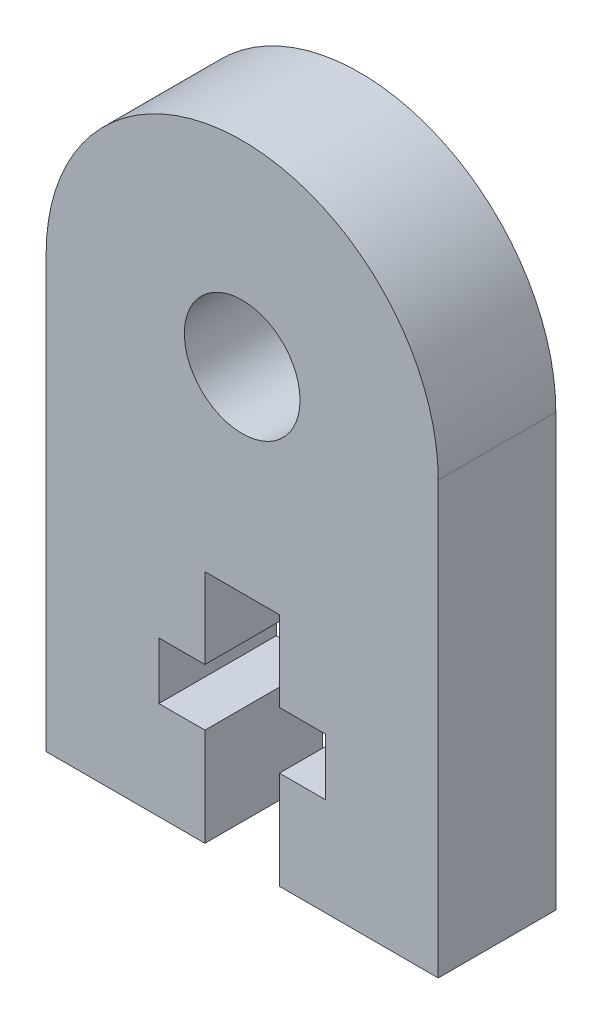
ISO-10303-21;
HEADER;
FILE_DESCRIPTION(('STEP AP214'),'2;1');
FILE_NAME('part.step','',(''),(''),'','','');
FILE_SCHEMA(('AUTOMOTIVE_DESIGN { 1 0 10303 214 1 1 1 1 }'));
ENDSEC;
DATA;
#1=APPLICATION_CONTEXT('core data for automotive mechanical design processes');
#2=APPLICATION_PROTOCOL_DEFINITION('international standard','automotive_design',2000,#1);
#3=PRODUCT_CONTEXT('',#1,'mechanical');
#4=PRODUCT('Part','Part','',(#3));
#5=PRODUCT_RELATED_PRODUCT_CATEGORY('part','',(#4));
#6=PRODUCT_DEFINITION_FORMATION('','',#4);
#7=PRODUCT_DEFINITION_CONTEXT('part definition',#1,'design');
#8=PRODUCT_DEFINITION('design','',#6,#7);
#9=PRODUCT_DEFINITION_SHAPE('','',#8);
#10=(LENGTH_UNIT() NAMED_UNIT(*) SI_UNIT(.MILLI.,.METRE.));
#11=(NAMED_UNIT(*) PLANE_ANGLE_UNIT() SI_UNIT($,.RADIAN.));
#12=(NAMED_UNIT(*) SI_UNIT($,.STERADIAN.) SOLID_ANGLE_UNIT());
#13=UNCERTAINTY_MEASURE_WITH_UNIT(LENGTH_MEASURE(1.E-05),#10,'distance_accuracy_value','');
#14=(GEOMETRIC_REPRESENTATION_CONTEXT(3) GLOBAL_UNCERTAINTY_ASSIGNED_CONTEXT((#13)) GLOBAL_UNIT_ASSIGNED_CONTEXT((#10,
#11,#12)) REPRESENTATION_CONTEXT('',''));
#15=CARTESIAN_POINT('',(0.,0.,0.));
#16=DIRECTION('',(0.,0.,1.));
#17=DIRECTION('',(1.,0.,0.));
#18=AXIS2_PLACEMENT_3D('',#15,#16,#17);
#19=CARTESIAN_POINT('',(-10.,-22.,6.));
#20=DIRECTION('',(0.,1.,0.));
#21=DIRECTION('',(-1.,0.,0.));
#22=AXIS2_PLACEMENT_3D('',#19,#20,#21);
#23=PLANE('',#22);
#24=DIRECTION('',(1.,0.,0.));
#25=VECTOR('',#24,1.);
#26=CARTESIAN_POINT('',(-10.,-22.,0.));
#27=LINE('',#26,#25);
#28=CARTESIAN_POINT('',(-10.,-22.,0.));
#29=VERTEX_POINT('',#28);
#30=CARTESIAN_POINT('',(-1.90000000000001,-22.,0.));
#31=VERTEX_POINT('',#30);
#32=EDGE_CURVE('E173',#29,#31,#27,.T.);
#33=ORIENTED_EDGE('',*,*,#32,.T.);
#34=DIRECTION('',(0.,0.,1.));
#35=VECTOR('',#34,1.);
#36=CARTESIAN_POINT('',(-1.90000000000001,-22.,0.));
#37=LINE('',#36,#35);
#38=CARTESIAN_POINT('',(-1.90000000000001,-22.,6.));
#39=VERTEX_POINT('',#38);
#40=EDGE_CURVE('E156',#31,#39,#37,.T.);
#41=ORIENTED_EDGE('',*,*,#40,.T.);
#42=DIRECTION('',(1.,0.,0.));
#43=VECTOR('',#42,1.);
#44=CARTESIAN_POINT('',(-10.,-22.,6.));
#45=LINE('',#44,#43);
#46=CARTESIAN_POINT('',(-10.,-22.,6.));
#47=VERTEX_POINT('',#46);
#48=EDGE_CURVE('E220',#47,#39,#45,.T.);
#49=ORIENTED_EDGE('',*,*,#48,.F.);
#50=DIRECTION('',(0.,0.,-1.));
#51=VECTOR('',#50,1.);
#52=CARTESIAN_POINT('',(-10.,-22.,6.));
#53=LINE('',#52,#51);
#54=EDGE_CURVE('E178',#47,#29,#53,.T.);
#55=ORIENTED_EDGE('',*,*,#54,.T.);
#56=EDGE_LOOP('',(#33,#41,#49,#55));
#57=FACE_BOUND('',#56,.T.);
#58=ADVANCED_FACE('F33',(#57),#23,.F.);
#59=CARTESIAN_POINT('',(0.,0.,6.));
#60=DIRECTION('',(0.,0.,-1.));
#61=DIRECTION('',(-1.,0.,0.));
#62=AXIS2_PLACEMENT_3D('',#59,#60,#61);
#63=PLANE('',#62);
#64=ORIENTED_EDGE('',*,*,#48,.T.);
#65=DIRECTION('',(0.,-1.,0.));
#66=VECTOR('',#65,1.);
#67=CARTESIAN_POINT('',(-1.90000000000001,-22.,6.));
#68=LINE('',#67,#66);
#69=CARTESIAN_POINT('',(-1.90000000000001,-17.,6.));
#70=VERTEX_POINT('',#69);
#71=EDGE_CURVE('E162',#70,#39,#68,.T.);
#72=ORIENTED_EDGE('',*,*,#71,.F.);
#73=DIRECTION('',(1.,0.,0.));
#74=VECTOR('',#73,1.);
#75=CARTESIAN_POINT('',(-4.25,-17.,6.));
#76=LINE('',#75,#74);
#77=CARTESIAN_POINT('',(-4.25,-17.,6.));
#78=VERTEX_POINT('',#77);
#79=EDGE_CURVE('E176',#78,#70,#76,.T.);
#80=ORIENTED_EDGE('',*,*,#79,.F.);
#81=DIRECTION('',(0.,-1.,0.));
#82=VECTOR('',#81,1.);
#83=CARTESIAN_POINT('',(-4.25,-14.1,6.));
#84=LINE('',#83,#82);
#85=CARTESIAN_POINT('',(-4.25,-14.1,6.));
#86=VERTEX_POINT('',#85);
#87=EDGE_CURVE('E255',#86,#78,#84,.T.);
#88=ORIENTED_EDGE('',*,*,#87,.F.);
#89=DIRECTION('',(-1.,0.,0.));
#90=VECTOR('',#89,1.);
#91=CARTESIAN_POINT('',(-4.25,-14.1,6.));
#92=LINE('',#91,#90);
#93=CARTESIAN_POINT('',(-1.90000000000001,-14.1,6.));
#94=VERTEX_POINT('',#93);
#95=EDGE_CURVE('E252',#94,#86,#92,.T.);
#96=ORIENTED_EDGE('',*,*,#95,.F.);
#97=DIRECTION('',(0.,-1.,0.));
#98=VECTOR('',#97,1.);
#99=CARTESIAN_POINT('',(-1.90000000000001,-14.1,6.));
#100=LINE('',#99,#98);
#101=CARTESIAN_POINT('',(-1.90000000000001,-10.,6.));
#102=VERTEX_POINT('',#101);
#103=EDGE_CURVE('E249',#102,#94,#100,.T.);
#104=ORIENTED_EDGE('',*,*,#103,.F.);
#105=DIRECTION('',(-1.,0.,0.));
#106=VECTOR('',#105,1.);
#107=CARTESIAN_POINT('',(-1.90000000000001,-10.,6.));
#108=LINE('',#107,#106);
#109=CARTESIAN_POINT('',(1.89999999999999,-10.,6.));
#110=VERTEX_POINT('',#109);
#111=EDGE_CURVE('E246',#110,#102,#108,.T.);
#112=ORIENTED_EDGE('',*,*,#111,.F.);
#113=DIRECTION('',(0.,1.,0.));
#114=VECTOR('',#113,1.);
#115=CARTESIAN_POINT('',(1.90000000000001,-14.1,6.));
#116=LINE('',#115,#114);
#117=CARTESIAN_POINT('',(1.90000000000001,-14.1,6.));
#118=VERTEX_POINT('',#117);
#119=EDGE_CURVE('E243',#118,#110,#116,.T.);
#120=ORIENTED_EDGE('',*,*,#119,.F.);
#121=DIRECTION('',(-1.,0.,0.));
#122=VECTOR('',#121,1.);
#123=CARTESIAN_POINT('',(1.90000000000001,-14.1,6.));
#124=LINE('',#123,#122);
#125=CARTESIAN_POINT('',(4.25,-14.1,6.));
#126=VERTEX_POINT('',#125);
#127=EDGE_CURVE('E240',#126,#118,#124,.T.);
#128=ORIENTED_EDGE('',*,*,#127,.F.);
#129=DIRECTION('',(0.,1.,0.));
#130=VECTOR('',#129,1.);
#131=CARTESIAN_POINT('',(4.25,-14.1,6.));
#132=LINE('',#131,#130);
#133=CARTESIAN_POINT('',(4.25,-17.,6.));
#134=VERTEX_POINT('',#133);
#135=EDGE_CURVE('E237',#134,#126,#132,.T.);
#136=ORIENTED_EDGE('',*,*,#135,.F.);
#137=DIRECTION('',(1.,0.,0.));
#138=VECTOR('',#137,1.);
#139=CARTESIAN_POINT('',(1.90000000000001,-17.,6.));
#140=LINE('',#139,#138);
#141=CARTESIAN_POINT('',(1.90000000000001,-17.,6.));
#142=VERTEX_POINT('',#141);
#143=EDGE_CURVE('E230',#142,#134,#140,.T.);
#144=ORIENTED_EDGE('',*,*,#143,.F.);
#145=DIRECTION('',(0.,1.,0.));
#146=VECTOR('',#145,1.);
#147=CARTESIAN_POINT('',(1.90000000000001,-22.,6.));
#148=LINE('',#147,#146);
#149=CARTESIAN_POINT('',(1.90000000000001,-22.,6.));
#150=VERTEX_POINT('',#149);
#151=EDGE_CURVE('E228',#150,#142,#148,.T.);
#152=ORIENTED_EDGE('',*,*,#151,.F.);
#153=CARTESIAN_POINT('',(10.,-22.,6.));
#154=VERTEX_POINT('',#153);
#155=EDGE_CURVE('E85',#150,#154,#45,.T.);
#156=ORIENTED_EDGE('',*,*,#155,.T.);
#157=DIRECTION('',(0.,1.,0.));
#158=VECTOR('',#157,1.);
#159=CARTESIAN_POINT('',(10.,-22.,6.));
#160=LINE('',#159,#158);
#161=CARTESIAN_POINT('',(10.,0.,6.));
#162=VERTEX_POINT('',#161);
#163=EDGE_CURVE('E205',#154,#162,#160,.T.);
#164=ORIENTED_EDGE('',*,*,#163,.T.);
#165=CARTESIAN_POINT('',(0.,0.,6.));
#166=DIRECTION('',(0.,0.,1.));
#167=DIRECTION('',(-1.,0.,0.));
#168=AXIS2_PLACEMENT_3D('',#165,#166,#167);
#169=CIRCLE('',#168,10.);
#170=CARTESIAN_POINT('',(-10.,0.,6.));
#171=VERTEX_POINT('',#170);
#172=EDGE_CURVE('E199',#162,#171,#169,.T.);
#173=ORIENTED_EDGE('',*,*,#172,.T.);
#174=DIRECTION('',(0.,-1.,0.));
#175=VECTOR('',#174,1.);
#176=CARTESIAN_POINT('',(-10.,0.,6.));
#177=LINE('',#176,#175);
#178=EDGE_CURVE('E57',#171,#47,#177,.T.);
#179=ORIENTED_EDGE('',*,*,#178,.T.);
#180=EDGE_LOOP('',(#64,#72,#80,#88,#96,#104,#112,#120,#128,#136,#144,#152,#156,#164,#173,#179));
#181=FACE_BOUND('',#180,.T.);
#182=CARTESIAN_POINT('',(0.,0.,6.));
#183=DIRECTION('',(0.,0.,1.));
#184=DIRECTION('',(1.,0.,0.));
#185=AXIS2_PLACEMENT_3D('',#182,#183,#184);
#186=CIRCLE('',#185,2.95);
#187=CARTESIAN_POINT('',(2.95,0.,6.));
#188=VERTEX_POINT('',#187);
#189=EDGE_CURVE('E184',#188,#188,#186,.T.);
#190=ORIENTED_EDGE('',*,*,#189,.F.);
#191=EDGE_LOOP('',(#190));
#192=FACE_BOUND('',#191,.T.);
#193=ADVANCED_FACE('F222',(#181,#192),#63,.F.);
#194=CARTESIAN_POINT('',(0.,0.,0.));
#195=DIRECTION('',(0.,0.,-1.));
#196=DIRECTION('',(-1.,0.,0.));
#197=AXIS2_PLACEMENT_3D('',#194,#195,#196);
#198=PLANE('',#197);
#199=DIRECTION('',(0.,-1.,0.));
#200=VECTOR('',#199,1.);
#201=CARTESIAN_POINT('',(-1.90000000000001,-22.,0.));
#202=LINE('',#201,#200);
#203=CARTESIAN_POINT('',(-1.90000000000001,-17.,0.));
#204=VERTEX_POINT('',#203);
#205=EDGE_CURVE('E159',#204,#31,#202,.T.);
#206=ORIENTED_EDGE('',*,*,#205,.T.);
#207=ORIENTED_EDGE('',*,*,#32,.F.);
#208=DIRECTION('',(0.,-1.,0.));
#209=VECTOR('',#208,1.);
#210=CARTESIAN_POINT('',(-10.,0.,0.));
#211=LINE('',#210,#209);
#212=CARTESIAN_POINT('',(-10.,0.,0.));
#213=VERTEX_POINT('',#212);
#214=EDGE_CURVE('E78',#213,#29,#211,.T.);
#215=ORIENTED_EDGE('',*,*,#214,.F.);
#216=CARTESIAN_POINT('',(0.,0.,0.));
#217=DIRECTION('',(0.,0.,1.));
#218=DIRECTION('',(-1.,0.,0.));
#219=AXIS2_PLACEMENT_3D('',#216,#217,#218);
#220=CIRCLE('',#219,10.);
#221=CARTESIAN_POINT('',(10.,0.,0.));
#222=VERTEX_POINT('',#221);
#223=EDGE_CURVE('E182',#222,#213,#220,.T.);
#224=ORIENTED_EDGE('',*,*,#223,.F.);
#225=DIRECTION('',(0.,1.,0.));
#226=VECTOR('',#225,1.);
#227=CARTESIAN_POINT('',(10.,-22.,0.));
#228=LINE('',#227,#226);
#229=CARTESIAN_POINT('',(10.,-22.,0.));
#230=VERTEX_POINT('',#229);
#231=EDGE_CURVE('E179',#230,#222,#228,.T.);
#232=ORIENTED_EDGE('',*,*,#231,.F.);
#233=CARTESIAN_POINT('',(1.90000000000001,-22.,0.));
#234=VERTEX_POINT('',#233);
#235=EDGE_CURVE('E180',#234,#230,#27,.T.);
#236=ORIENTED_EDGE('',*,*,#235,.F.);
#237=DIRECTION('',(0.,1.,0.));
#238=VECTOR('',#237,1.);
#239=CARTESIAN_POINT('',(1.90000000000001,-22.,0.));
#240=LINE('',#239,#238);
#241=CARTESIAN_POINT('',(1.90000000000001,-17.,0.));
#242=VERTEX_POINT('',#241);
#243=EDGE_CURVE('E48',#234,#242,#240,.T.);
#244=ORIENTED_EDGE('',*,*,#243,.T.);
#245=DIRECTION('',(1.,0.,0.));
#246=VECTOR('',#245,1.);
#247=CARTESIAN_POINT('',(1.90000000000001,-17.,0.));
#248=LINE('',#247,#246);
#249=CARTESIAN_POINT('',(4.25,-17.,0.));
#250=VERTEX_POINT('',#249);
#251=EDGE_CURVE('E296',#242,#250,#248,.T.);
#252=ORIENTED_EDGE('',*,*,#251,.T.);
#253=DIRECTION('',(0.,1.,0.));
#254=VECTOR('',#253,1.);
#255=CARTESIAN_POINT('',(4.25,-14.1,0.));
#256=LINE('',#255,#254);
#257=CARTESIAN_POINT('',(4.25,-14.1,0.));
#258=VERTEX_POINT('',#257);
#259=EDGE_CURVE('E279',#250,#258,#256,.T.);
#260=ORIENTED_EDGE('',*,*,#259,.T.);
#261=DIRECTION('',(-1.,0.,0.));
#262=VECTOR('',#261,1.);
#263=CARTESIAN_POINT('',(1.90000000000001,-14.1,0.));
#264=LINE('',#263,#262);
#265=CARTESIAN_POINT('',(1.90000000000001,-14.1,0.));
#266=VERTEX_POINT('',#265);
#267=EDGE_CURVE('E292',#258,#266,#264,.T.);
#268=ORIENTED_EDGE('',*,*,#267,.T.);
#269=DIRECTION('',(0.,1.,0.));
#270=VECTOR('',#269,1.);
#271=CARTESIAN_POINT('',(1.90000000000001,-14.1,0.));
#272=LINE('',#271,#270);
#273=CARTESIAN_POINT('',(1.89999999999999,-10.,0.));
#274=VERTEX_POINT('',#273);
#275=EDGE_CURVE('E294',#266,#274,#272,.T.);
#276=ORIENTED_EDGE('',*,*,#275,.T.);
#277=DIRECTION('',(-1.,0.,0.));
#278=VECTOR('',#277,1.);
#279=CARTESIAN_POINT('',(-1.90000000000001,-10.,0.));
#280=LINE('',#279,#278);
#281=CARTESIAN_POINT('',(-1.90000000000001,-10.,0.));
#282=VERTEX_POINT('',#281);
#283=EDGE_CURVE('E302',#274,#282,#280,.T.);
#284=ORIENTED_EDGE('',*,*,#283,.T.);
#285=DIRECTION('',(0.,-1.,0.));
#286=VECTOR('',#285,1.);
#287=CARTESIAN_POINT('',(-1.90000000000001,-14.1,0.));
#288=LINE('',#287,#286);
#289=CARTESIAN_POINT('',(-1.90000000000001,-14.1,0.));
#290=VERTEX_POINT('',#289);
#291=EDGE_CURVE('E305',#282,#290,#288,.T.);
#292=ORIENTED_EDGE('',*,*,#291,.T.);
#293=DIRECTION('',(-1.,0.,0.));
#294=VECTOR('',#293,1.);
#295=CARTESIAN_POINT('',(-4.25,-14.1,0.));
#296=LINE('',#295,#294);
#297=CARTESIAN_POINT('',(-4.25,-14.1,0.));
#298=VERTEX_POINT('',#297);
#299=EDGE_CURVE('E308',#290,#298,#296,.T.);
#300=ORIENTED_EDGE('',*,*,#299,.T.);
#301=DIRECTION('',(0.,-1.,0.));
#302=VECTOR('',#301,1.);
#303=CARTESIAN_POINT('',(-4.25,-14.1,0.));
#304=LINE('',#303,#302);
#305=CARTESIAN_POINT('',(-4.25,-17.,0.));
#306=VERTEX_POINT('',#305);
#307=EDGE_CURVE('E310',#298,#306,#304,.T.);
#308=ORIENTED_EDGE('',*,*,#307,.T.);
#309=DIRECTION('',(1.,0.,0.));
#310=VECTOR('',#309,1.);
#311=CARTESIAN_POINT('',(-4.25,-17.,0.));
#312=LINE('',#311,#310);
#313=EDGE_CURVE('E167',#306,#204,#312,.T.);
#314=ORIENTED_EDGE('',*,*,#313,.T.);
#315=EDGE_LOOP('',(#206,#207,#215,#224,#232,#236,#244,#252,#260,#268,#276,#284,#292,#300,#308,#314));
#316=FACE_BOUND('',#315,.T.);
#317=CARTESIAN_POINT('',(0.,0.,0.));
#318=DIRECTION('',(0.,0.,1.));
#319=DIRECTION('',(1.,0.,0.));
#320=AXIS2_PLACEMENT_3D('',#317,#318,#319);
#321=CIRCLE('',#320,2.95);
#322=CARTESIAN_POINT('',(2.95,0.,0.));
#323=VERTEX_POINT('',#322);
#324=EDGE_CURVE('E216',#323,#323,#321,.T.);
#325=ORIENTED_EDGE('',*,*,#324,.T.);
#326=EDGE_LOOP('',(#325));
#327=FACE_BOUND('',#326,.T.);
#328=ADVANCED_FACE('F171',(#316,#327),#198,.T.);
#329=ORIENTED_EDGE('',*,*,#155,.F.);
#330=DIRECTION('',(0.,0.,1.));
#331=VECTOR('',#330,1.);
#332=CARTESIAN_POINT('',(1.90000000000001,-22.,0.));
#333=LINE('',#332,#331);
#334=EDGE_CURVE('E166',#234,#150,#333,.T.);
#335=ORIENTED_EDGE('',*,*,#334,.F.);
#336=ORIENTED_EDGE('',*,*,#235,.T.);
#337=DIRECTION('',(0.,0.,-1.));
#338=VECTOR('',#337,1.);
#339=CARTESIAN_POINT('',(10.,-22.,6.));
#340=LINE('',#339,#338);
#341=EDGE_CURVE('E11',#154,#230,#340,.T.);
#342=ORIENTED_EDGE('',*,*,#341,.F.);
#343=EDGE_LOOP('',(#329,#335,#336,#342));
#344=FACE_BOUND('',#343,.T.);
#345=ADVANCED_FACE('F35',(#344),#23,.F.);
#346=CARTESIAN_POINT('',(10.,-22.,6.));
#347=DIRECTION('',(-1.,0.,0.));
#348=DIRECTION('',(0.,-1.,0.));
#349=AXIS2_PLACEMENT_3D('',#346,#347,#348);
#350=PLANE('',#349);
#351=ORIENTED_EDGE('',*,*,#231,.T.);
#352=DIRECTION('',(0.,0.,-1.));
#353=VECTOR('',#352,1.);
#354=CARTESIAN_POINT('',(10.,0.,6.));
#355=LINE('',#354,#353);
#356=EDGE_CURVE('E41',#162,#222,#355,.T.);
#357=ORIENTED_EDGE('',*,*,#356,.F.);
#358=ORIENTED_EDGE('',*,*,#163,.F.);
#359=ORIENTED_EDGE('',*,*,#341,.T.);
#360=EDGE_LOOP('',(#351,#357,#358,#359));
#361=FACE_BOUND('',#360,.T.);
#362=ADVANCED_FACE('F204',(#361),#350,.F.);
#363=CARTESIAN_POINT('',(0.,0.,6.));
#364=DIRECTION('',(0.,0.,-1.));
#365=DIRECTION('',(-1.,0.,0.));
#366=AXIS2_PLACEMENT_3D('',#363,#364,#365);
#367=CYLINDRICAL_SURFACE('',#366,10.);
#368=ORIENTED_EDGE('',*,*,#223,.T.);
#369=DIRECTION('',(0.,0.,-1.));
#370=VECTOR('',#369,1.);
#371=CARTESIAN_POINT('',(-10.,0.,6.));
#372=LINE('',#371,#370);
#373=EDGE_CURVE('E191',#171,#213,#372,.T.);
#374=ORIENTED_EDGE('',*,*,#373,.F.);
#375=ORIENTED_EDGE('',*,*,#172,.F.);
#376=ORIENTED_EDGE('',*,*,#356,.T.);
#377=EDGE_LOOP('',(#368,#374,#375,#376));
#378=FACE_BOUND('',#377,.T.);
#379=ADVANCED_FACE('F197',(#378),#367,.T.);
#380=CARTESIAN_POINT('',(-10.,0.,6.));
#381=DIRECTION('',(1.,0.,0.));
#382=DIRECTION('',(0.,1.,0.));
#383=AXIS2_PLACEMENT_3D('',#380,#381,#382);
#384=PLANE('',#383);
#385=ORIENTED_EDGE('',*,*,#214,.T.);
#386=ORIENTED_EDGE('',*,*,#54,.F.);
#387=ORIENTED_EDGE('',*,*,#178,.F.);
#388=ORIENTED_EDGE('',*,*,#373,.T.);
#389=EDGE_LOOP('',(#385,#386,#387,#388));
#390=FACE_BOUND('',#389,.T.);
#391=ADVANCED_FACE('F224',(#390),#384,.F.);
#392=CARTESIAN_POINT('',(0.,0.,6.));
#393=DIRECTION('',(0.,0.,-1.));
#394=DIRECTION('',(-1.,0.,0.));
#395=AXIS2_PLACEMENT_3D('',#392,#393,#394);
#396=CYLINDRICAL_SURFACE('',#395,2.95);
#397=ORIENTED_EDGE('',*,*,#189,.T.);
#398=EDGE_LOOP('',(#397));
#399=FACE_BOUND('',#398,.T.);
#400=ORIENTED_EDGE('',*,*,#324,.F.);
#401=EDGE_LOOP('',(#400));
#402=FACE_BOUND('',#401,.T.);
#403=ADVANCED_FACE('F325',(#399,#402),#396,.F.);
#404=CARTESIAN_POINT('',(-1.90000000000001,-22.,0.));
#405=DIRECTION('',(-1.,0.,0.));
#406=DIRECTION('',(0.,-1.,0.));
#407=AXIS2_PLACEMENT_3D('',#404,#405,#406);
#408=PLANE('',#407);
#409=ORIENTED_EDGE('',*,*,#71,.T.);
#410=ORIENTED_EDGE('',*,*,#40,.F.);
#411=ORIENTED_EDGE('',*,*,#205,.F.);
#412=DIRECTION('',(0.,0.,1.));
#413=VECTOR('',#412,1.);
#414=CARTESIAN_POINT('',(-1.90000000000001,-17.,0.));
#415=LINE('',#414,#413);
#416=EDGE_CURVE('E219',#204,#70,#415,.T.);
#417=ORIENTED_EDGE('',*,*,#416,.T.);
#418=EDGE_LOOP('',(#409,#410,#411,#417));
#419=FACE_BOUND('',#418,.T.);
#420=ADVANCED_FACE('F158',(#419),#408,.F.);
#421=CARTESIAN_POINT('',(-4.25,-17.,0.));
#422=DIRECTION('',(0.,-1.,0.));
#423=DIRECTION('',(0.,0.,-1.));
#424=AXIS2_PLACEMENT_3D('',#421,#422,#423);
#425=PLANE('',#424);
#426=ORIENTED_EDGE('',*,*,#79,.T.);
#427=ORIENTED_EDGE('',*,*,#416,.F.);
#428=ORIENTED_EDGE('',*,*,#313,.F.);
#429=DIRECTION('',(0.,0.,1.));
#430=VECTOR('',#429,1.);
#431=CARTESIAN_POINT('',(-4.25,-17.,0.));
#432=LINE('',#431,#430);
#433=EDGE_CURVE('E260',#306,#78,#432,.T.);
#434=ORIENTED_EDGE('',*,*,#433,.T.);
#435=EDGE_LOOP('',(#426,#427,#428,#434));
#436=FACE_BOUND('',#435,.T.);
#437=ADVANCED_FACE('F316',(#436),#425,.F.);
#438=CARTESIAN_POINT('',(-4.25,-14.1,0.));
#439=DIRECTION('',(-1.,0.,0.));
#440=DIRECTION('',(0.,-1.,0.));
#441=AXIS2_PLACEMENT_3D('',#438,#439,#440);
#442=PLANE('',#441);
#443=ORIENTED_EDGE('',*,*,#87,.T.);
#444=ORIENTED_EDGE('',*,*,#433,.F.);
#445=ORIENTED_EDGE('',*,*,#307,.F.);
#446=DIRECTION('',(0.,0.,1.));
#447=VECTOR('',#446,1.);
#448=CARTESIAN_POINT('',(-4.25,-14.1,0.));
#449=LINE('',#448,#447);
#450=EDGE_CURVE('E262',#298,#86,#449,.T.);
#451=ORIENTED_EDGE('',*,*,#450,.T.);
#452=EDGE_LOOP('',(#443,#444,#445,#451));
#453=FACE_BOUND('',#452,.T.);
#454=ADVANCED_FACE('F314',(#453),#442,.F.);
#455=CARTESIAN_POINT('',(-4.25,-14.1,0.));
#456=DIRECTION('',(0.,1.,0.));
#457=DIRECTION('',(0.,0.,1.));
#458=AXIS2_PLACEMENT_3D('',#455,#456,#457);
#459=PLANE('',#458);
#460=ORIENTED_EDGE('',*,*,#95,.T.);
#461=ORIENTED_EDGE('',*,*,#450,.F.);
#462=ORIENTED_EDGE('',*,*,#299,.F.);
#463=DIRECTION('',(0.,0.,1.));
#464=VECTOR('',#463,1.);
#465=CARTESIAN_POINT('',(-1.90000000000001,-14.1,0.));
#466=LINE('',#465,#464);
#467=EDGE_CURVE('E264',#290,#94,#466,.T.);
#468=ORIENTED_EDGE('',*,*,#467,.T.);
#469=EDGE_LOOP('',(#460,#461,#462,#468));
#470=FACE_BOUND('',#469,.T.);
#471=ADVANCED_FACE('F323',(#470),#459,.F.);
#472=CARTESIAN_POINT('',(-1.90000000000001,-14.1,0.));
#473=DIRECTION('',(-1.,0.,0.));
#474=DIRECTION('',(0.,0.,1.));
#475=AXIS2_PLACEMENT_3D('',#472,#473,#474);
#476=PLANE('',#475);
#477=ORIENTED_EDGE('',*,*,#103,.T.);
#478=ORIENTED_EDGE('',*,*,#467,.F.);
#479=ORIENTED_EDGE('',*,*,#291,.F.);
#480=DIRECTION('',(0.,0.,1.));
#481=VECTOR('',#480,1.);
#482=CARTESIAN_POINT('',(-1.90000000000001,-10.,0.));
#483=LINE('',#482,#481);
#484=EDGE_CURVE('E266',#282,#102,#483,.T.);
#485=ORIENTED_EDGE('',*,*,#484,.T.);
#486=EDGE_LOOP('',(#477,#478,#479,#485));
#487=FACE_BOUND('',#486,.T.);
#488=ADVANCED_FACE('F385',(#487),#476,.F.);
#489=CARTESIAN_POINT('',(-1.90000000000001,-10.,0.));
#490=DIRECTION('',(0.,1.,0.));
#491=DIRECTION('',(0.,0.,1.));
#492=AXIS2_PLACEMENT_3D('',#489,#490,#491);
#493=PLANE('',#492);
#494=ORIENTED_EDGE('',*,*,#111,.T.);
#495=ORIENTED_EDGE('',*,*,#484,.F.);
#496=ORIENTED_EDGE('',*,*,#283,.F.);
#497=DIRECTION('',(0.,0.,1.));
#498=VECTOR('',#497,1.);
#499=CARTESIAN_POINT('',(1.89999999999999,-10.,0.));
#500=LINE('',#499,#498);
#501=EDGE_CURVE('E268',#274,#110,#500,.T.);
#502=ORIENTED_EDGE('',*,*,#501,.T.);
#503=EDGE_LOOP('',(#494,#495,#496,#502));
#504=FACE_BOUND('',#503,.T.);
#505=ADVANCED_FACE('F395',(#504),#493,.F.);
#506=CARTESIAN_POINT('',(1.90000000000001,-14.1,0.));
#507=DIRECTION('',(1.,0.,0.));
#508=DIRECTION('',(0.,1.,0.));
#509=AXIS2_PLACEMENT_3D('',#506,#507,#508);
#510=PLANE('',#509);
#511=ORIENTED_EDGE('',*,*,#119,.T.);
#512=ORIENTED_EDGE('',*,*,#501,.F.);
#513=ORIENTED_EDGE('',*,*,#275,.F.);
#514=DIRECTION('',(0.,0.,1.));
#515=VECTOR('',#514,1.);
#516=CARTESIAN_POINT('',(1.90000000000001,-14.1,0.));
#517=LINE('',#516,#515);
#518=EDGE_CURVE('E270',#266,#118,#517,.T.);
#519=ORIENTED_EDGE('',*,*,#518,.T.);
#520=EDGE_LOOP('',(#511,#512,#513,#519));
#521=FACE_BOUND('',#520,.T.);
#522=ADVANCED_FACE('F405',(#521),#510,.F.);
#523=CARTESIAN_POINT('',(1.90000000000001,-14.1,0.));
#524=DIRECTION('',(0.,1.,0.));
#525=DIRECTION('',(0.,0.,1.));
#526=AXIS2_PLACEMENT_3D('',#523,#524,#525);
#527=PLANE('',#526);
#528=ORIENTED_EDGE('',*,*,#127,.T.);
#529=ORIENTED_EDGE('',*,*,#518,.F.);
#530=ORIENTED_EDGE('',*,*,#267,.F.);
#531=DIRECTION('',(0.,0.,1.));
#532=VECTOR('',#531,1.);
#533=CARTESIAN_POINT('',(4.25,-14.1,0.));
#534=LINE('',#533,#532);
#535=EDGE_CURVE('E272',#258,#126,#534,.T.);
#536=ORIENTED_EDGE('',*,*,#535,.T.);
#537=EDGE_LOOP('',(#528,#529,#530,#536));
#538=FACE_BOUND('',#537,.T.);
#539=ADVANCED_FACE('F288',(#538),#527,.F.);
#540=CARTESIAN_POINT('',(4.25,-14.1,0.));
#541=DIRECTION('',(1.,0.,0.));
#542=DIRECTION('',(0.,1.,0.));
#543=AXIS2_PLACEMENT_3D('',#540,#541,#542);
#544=PLANE('',#543);
#545=ORIENTED_EDGE('',*,*,#135,.T.);
#546=ORIENTED_EDGE('',*,*,#535,.F.);
#547=ORIENTED_EDGE('',*,*,#259,.F.);
#548=DIRECTION('',(0.,0.,1.));
#549=VECTOR('',#548,1.);
#550=CARTESIAN_POINT('',(4.25,-17.,0.));
#551=LINE('',#550,#549);
#552=EDGE_CURVE('E210',#250,#134,#551,.T.);
#553=ORIENTED_EDGE('',*,*,#552,.T.);
#554=EDGE_LOOP('',(#545,#546,#547,#553));
#555=FACE_BOUND('',#554,.T.);
#556=ADVANCED_FACE('F275',(#555),#544,.F.);
#557=CARTESIAN_POINT('',(1.90000000000001,-17.,0.));
#558=DIRECTION('',(0.,-1.,0.));
#559=DIRECTION('',(0.,0.,-1.));
#560=AXIS2_PLACEMENT_3D('',#557,#558,#559);
#561=PLANE('',#560);
#562=ORIENTED_EDGE('',*,*,#143,.T.);
#563=ORIENTED_EDGE('',*,*,#552,.F.);
#564=ORIENTED_EDGE('',*,*,#251,.F.);
#565=DIRECTION('',(0.,0.,1.));
#566=VECTOR('',#565,1.);
#567=CARTESIAN_POINT('',(1.90000000000001,-17.,0.));
#568=LINE('',#567,#566);
#569=EDGE_CURVE('E208',#242,#142,#568,.T.);
#570=ORIENTED_EDGE('',*,*,#569,.T.);
#571=EDGE_LOOP('',(#562,#563,#564,#570));
#572=FACE_BOUND('',#571,.T.);
#573=ADVANCED_FACE('F284',(#572),#561,.F.);
#574=CARTESIAN_POINT('',(1.90000000000001,-22.,0.));
#575=DIRECTION('',(1.,0.,0.));
#576=DIRECTION('',(0.,1.,0.));
#577=AXIS2_PLACEMENT_3D('',#574,#575,#576);
#578=PLANE('',#577);
#579=ORIENTED_EDGE('',*,*,#151,.T.);
#580=ORIENTED_EDGE('',*,*,#569,.F.);
#581=ORIENTED_EDGE('',*,*,#243,.F.);
#582=ORIENTED_EDGE('',*,*,#334,.T.);
#583=EDGE_LOOP('',(#579,#580,#581,#582));
#584=FACE_BOUND('',#583,.T.);
#585=ADVANCED_FACE('F440',(#584),#578,.F.);
#586=CLOSED_SHELL('',(#58,#193,#328,#345,#362,#379,#391,#403,#420,#437,#454,#471,#488,#505,#522,
#539,#556,#573,#585));
#587=MANIFOLD_SOLID_BREP('B2',#586);
#588=ADVANCED_BREP_SHAPE_REPRESENTATION('',(#18,#587),#14);
#589=SHAPE_DEFINITION_REPRESENTATION(#9,#588);
ENDSEC;
END-ISO-10303-21;
